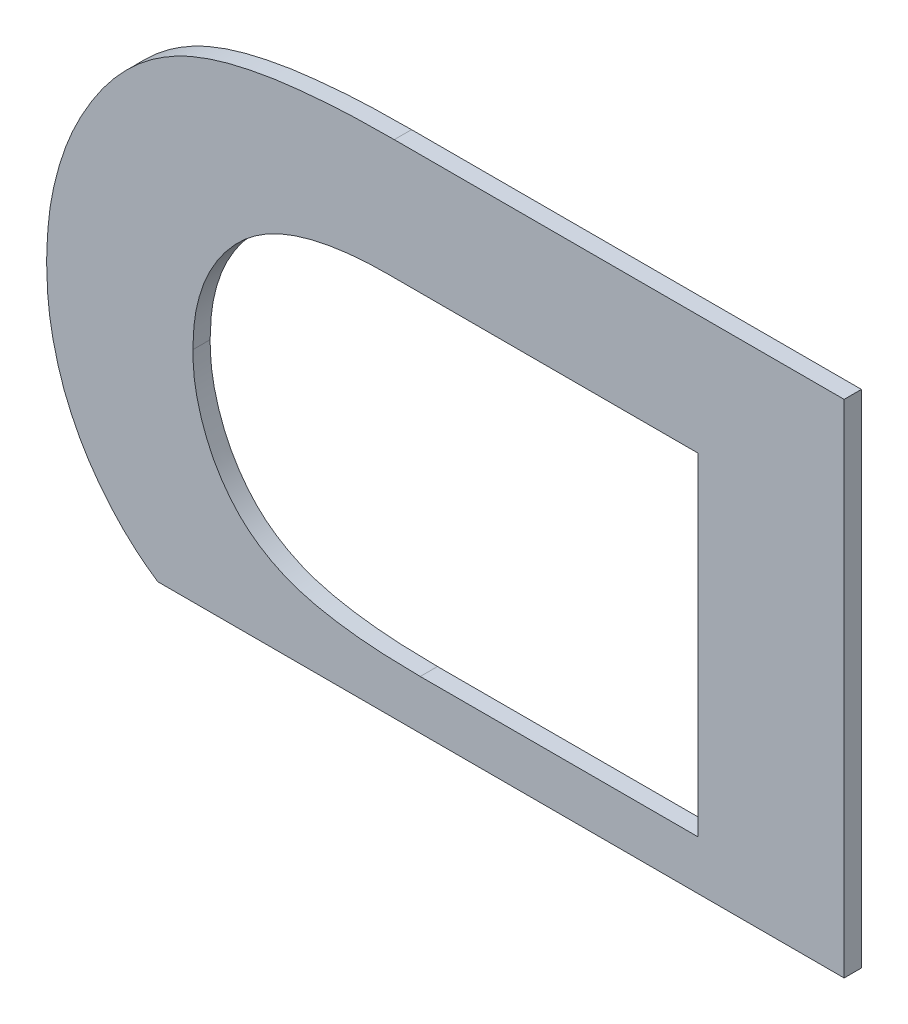
ISO-10303-21;
HEADER;
FILE_DESCRIPTION(('STEP AP214'),'2;1');
FILE_NAME('part.step','',(''),(''),'','','');
FILE_SCHEMA(('AUTOMOTIVE_DESIGN { 1 0 10303 214 1 1 1 1 }'));
ENDSEC;
DATA;
#1=APPLICATION_CONTEXT('core data for automotive mechanical design processes');
#2=APPLICATION_PROTOCOL_DEFINITION('international standard','automotive_design',2000,#1);
#3=PRODUCT_CONTEXT('',#1,'mechanical');
#4=PRODUCT('Part','Part','',(#3));
#5=PRODUCT_RELATED_PRODUCT_CATEGORY('part','',(#4));
#6=PRODUCT_DEFINITION_FORMATION('','',#4);
#7=PRODUCT_DEFINITION_CONTEXT('part definition',#1,'design');
#8=PRODUCT_DEFINITION('design','',#6,#7);
#9=PRODUCT_DEFINITION_SHAPE('','',#8);
#10=(LENGTH_UNIT() NAMED_UNIT(*) SI_UNIT(.MILLI.,.METRE.));
#11=(NAMED_UNIT(*) PLANE_ANGLE_UNIT() SI_UNIT($,.RADIAN.));
#12=(NAMED_UNIT(*) SI_UNIT($,.STERADIAN.) SOLID_ANGLE_UNIT());
#13=UNCERTAINTY_MEASURE_WITH_UNIT(LENGTH_MEASURE(1.E-05),#10,'distance_accuracy_value','');
#14=(GEOMETRIC_REPRESENTATION_CONTEXT(3) GLOBAL_UNCERTAINTY_ASSIGNED_CONTEXT((#13)) GLOBAL_UNIT_ASSIGNED_CONTEXT((#10,
#11,#12)) REPRESENTATION_CONTEXT('',''));
#15=CARTESIAN_POINT('',(0.,0.,0.));
#16=DIRECTION('',(0.,0.,1.));
#17=DIRECTION('',(1.,0.,0.));
#18=AXIS2_PLACEMENT_3D('',#15,#16,#17);
#19=CARTESIAN_POINT('',(11.5384615384616,-15.,0.5));
#20=DIRECTION('',(-1.,0.,0.));
#21=DIRECTION('',(0.,0.,1.));
#22=AXIS2_PLACEMENT_3D('',#19,#20,#21);
#23=PLANE('',#22);
#24=DIRECTION('',(0.,1.,0.));
#25=VECTOR('',#24,1.);
#26=CARTESIAN_POINT('',(11.5384615384616,-15.,0.5));
#27=LINE('',#26,#25);
#28=CARTESIAN_POINT('',(11.5384615384616,0.5,0.5));
#29=VERTEX_POINT('',#28);
#30=CARTESIAN_POINT('',(11.5384615384616,15.,0.5));
#31=VERTEX_POINT('',#30);
#32=EDGE_CURVE('E132',#29,#31,#27,.T.);
#33=ORIENTED_EDGE('',*,*,#32,.F.);
#34=DIRECTION('',(0.,0.,-1.));
#35=VECTOR('',#34,1.);
#36=CARTESIAN_POINT('',(11.5384615384616,0.5,0.5));
#37=LINE('',#36,#35);
#38=CARTESIAN_POINT('',(11.5384615384616,0.5,0.));
#39=VERTEX_POINT('',#38);
#40=EDGE_CURVE('E53',#29,#39,#37,.T.);
#41=ORIENTED_EDGE('',*,*,#40,.T.);
#42=DIRECTION('',(0.,1.,0.));
#43=VECTOR('',#42,1.);
#44=CARTESIAN_POINT('',(11.5384615384616,-15.,0.));
#45=LINE('',#44,#43);
#46=CARTESIAN_POINT('',(11.5384615384616,15.,0.));
#47=VERTEX_POINT('',#46);
#48=EDGE_CURVE('E128',#39,#47,#45,.T.);
#49=ORIENTED_EDGE('',*,*,#48,.T.);
#50=DIRECTION('',(0.,0.,-1.));
#51=VECTOR('',#50,1.);
#52=CARTESIAN_POINT('',(11.5384615384616,15.,0.5));
#53=LINE('',#52,#51);
#54=EDGE_CURVE('E164',#31,#47,#53,.T.);
#55=ORIENTED_EDGE('',*,*,#54,.F.);
#56=EDGE_LOOP('',(#33,#41,#49,#55));
#57=FACE_BOUND('',#56,.T.);
#58=ADVANCED_FACE('F39',(#57),#23,.F.);
#59=CARTESIAN_POINT('',(-11.5384615384615,6.91105769230769,0.5));
#60=CARTESIAN_POINT('',(-11.5325910596808,6.65443287104843,0.5));
#61=CARTESIAN_POINT('',(-11.5209964615086,6.14758125048622,0.5));
#62=CARTESIAN_POINT('',(-11.4321806731945,5.40237369942187,0.5));
#63=CARTESIAN_POINT('',(-11.27147567516,4.69035785069766,0.5));
#64=CARTESIAN_POINT('',(-11.065403190656,4.00529799715841,0.5));
#65=CARTESIAN_POINT('',(-10.7833528257358,3.35690034192733,0.5));
#66=CARTESIAN_POINT('',(-10.4566097203037,2.73192116530323,0.5));
#67=CARTESIAN_POINT('',(-10.0518214672469,2.14753031268846,0.5));
#68=CARTESIAN_POINT('',(-9.59861625564332,1.58816639265529,0.5));
#69=CARTESIAN_POINT('',(-9.07891141140609,1.06580948697466,0.5));
#70=CARTESIAN_POINT('',(-8.48813510211721,0.599304948528562,0.5));
#71=CARTESIAN_POINT('',(-7.83214355776586,0.179683182375531,0.5));
#72=CARTESIAN_POINT('',(-7.10784732151527,-0.181478283915422,0.5));
#73=CARTESIAN_POINT('',(-6.32358377122331,-0.511597010464015,0.5));
#74=CARTESIAN_POINT('',(-5.46951255367587,-0.777424515079016,0.5));
#75=CARTESIAN_POINT('',(-4.54908062908904,-0.994493056469318,0.5));
#76=CARTESIAN_POINT('',(-3.91099443386552,-1.0996060210974,0.5));
#77=CARTESIAN_POINT('',(-3.58173076923075,-1.15384615384615,0.5));
#78=B_SPLINE_CURVE_WITH_KNOTS('',3,(#59,#60,#61,#62,#63,#64,#65,#66,#67,#68,#69,#70,#71,#72,#73,
#74,#75,#76,#77),.UNSPECIFIED.,.F.,.F.,(4,1,1,1,1,1,1,1,1,1,1,1,1,1,1,1,4),(0.,
0.0614130692946595,0.121295023384547,0.17922404230872,0.235938094734832,0.292216833267361,
0.348196639434207,0.404444738963359,0.462025533922997,0.520334211868149,0.580382901650838,
0.641825904813988,0.706363209796628,0.77385139382756,0.845266257356883,0.920154675768406,1.),.UNSPECIFIED.);
#79=DIRECTION('',(0.,0.,-1.));
#80=VECTOR('',#79,1.);
#81=SURFACE_OF_LINEAR_EXTRUSION('',#78,#80);
#82=CARTESIAN_POINT('',(-11.5384615384615,6.91105769230769,0.));
#83=CARTESIAN_POINT('',(-11.5325910596808,6.65443287104843,0.));
#84=CARTESIAN_POINT('',(-11.5209964615086,6.14758125048622,0.));
#85=CARTESIAN_POINT('',(-11.4321806731945,5.40237369942187,0.));
#86=CARTESIAN_POINT('',(-11.27147567516,4.69035785069766,0.));
#87=CARTESIAN_POINT('',(-11.065403190656,4.00529799715841,0.));
#88=CARTESIAN_POINT('',(-10.7833528257358,3.35690034192733,0.));
#89=CARTESIAN_POINT('',(-10.4566097203037,2.73192116530323,0.));
#90=CARTESIAN_POINT('',(-10.0518214672469,2.14753031268846,0.));
#91=CARTESIAN_POINT('',(-9.59861625564332,1.58816639265529,0.));
#92=CARTESIAN_POINT('',(-9.07891141140609,1.06580948697466,0.));
#93=CARTESIAN_POINT('',(-8.48813510211721,0.599304948528562,0.));
#94=CARTESIAN_POINT('',(-7.83214355776586,0.179683182375531,0.));
#95=CARTESIAN_POINT('',(-7.10784732151527,-0.181478283915422,0.));
#96=CARTESIAN_POINT('',(-6.32358377122331,-0.511597010464015,0.));
#97=CARTESIAN_POINT('',(-5.46951255367587,-0.777424515079016,0.));
#98=CARTESIAN_POINT('',(-4.54908062908904,-0.994493056469318,0.));
#99=CARTESIAN_POINT('',(-3.91099443386552,-1.0996060210974,0.));
#100=CARTESIAN_POINT('',(-3.58173076923075,-1.15384615384615,0.));
#101=B_SPLINE_CURVE_WITH_KNOTS('',3,(#82,#83,#84,#85,#86,#87,#88,#89,#90,#91,#92,#93,#94,#95,
#96,#97,#98,#99,#100),.UNSPECIFIED.,.F.,.F.,(4,1,1,1,1,1,1,1,1,1,1,1,1,1,1,1,4),(0.,
0.0614130692946595,0.121295023384547,0.17922404230872,0.235938094734832,0.292216833267361,
0.348196639434207,0.404444738963359,0.462025533922997,0.520334211868149,0.580382901650838,
0.641825904813988,0.706363209796628,0.77385139382756,0.845266257356883,0.920154675768406,1.),.UNSPECIFIED.);
#102=CARTESIAN_POINT('',(-11.5384615384615,6.91105769230769,0.));
#103=VERTEX_POINT('',#102);
#104=CARTESIAN_POINT('',(-8.32266291929529,0.50000000308461,0.));
#105=VERTEX_POINT('',#104);
#106=EDGE_CURVE('E120',#103,#105,#101,.T.);
#107=ORIENTED_EDGE('',*,*,#106,.T.);
#108=DIRECTION('',(0.,0.,-1.));
#109=VECTOR('',#108,1.);
#110=CARTESIAN_POINT('',(-8.32266291471817,0.499999999997698,0.5));
#111=LINE('',#110,#109);
#112=CARTESIAN_POINT('',(-8.32266292016869,0.5,0.5));
#113=VERTEX_POINT('',#112);
#114=EDGE_CURVE('E106',#105,#113,#111,.F.);
#115=ORIENTED_EDGE('',*,*,#114,.T.);
#116=CARTESIAN_POINT('',(-11.5384615384615,6.91105769230769,0.5));
#117=VERTEX_POINT('',#116);
#118=EDGE_CURVE('E139',#117,#113,#78,.T.);
#119=ORIENTED_EDGE('',*,*,#118,.F.);
#120=DIRECTION('',(0.,0.,-1.));
#121=VECTOR('',#120,1.);
#122=CARTESIAN_POINT('',(-11.5384615384615,6.91105769230769,0.5));
#123=LINE('',#122,#121);
#124=EDGE_CURVE('E119',#117,#103,#123,.T.);
#125=ORIENTED_EDGE('',*,*,#124,.T.);
#126=EDGE_LOOP('',(#107,#115,#119,#125));
#127=FACE_BOUND('',#126,.T.);
#128=ADVANCED_FACE('F126',(#127),#81,.F.);
#129=CARTESIAN_POINT('',(-8.58731063474944,13.4318140781607,0.5));
#130=DIRECTION('',(0.,0.,-1.));
#131=DIRECTION('',(-1.,0.,0.));
#132=AXIS2_PLACEMENT_3D('',#129,#130,#131);
#133=PLANE('',#132);
#134=DIRECTION('',(1.,0.,0.));
#135=VECTOR('',#134,1.);
#136=CARTESIAN_POINT('',(-1.63461538461537,11.5384615384615,0.5));
#137=LINE('',#136,#135);
#138=CARTESIAN_POINT('',(-1.63461538461537,11.5384615384615,0.5));
#139=VERTEX_POINT('',#138);
#140=CARTESIAN_POINT('',(7.30769230769232,11.5384615384615,0.5));
#141=VERTEX_POINT('',#140);
#142=EDGE_CURVE('E174',#139,#141,#137,.T.);
#143=ORIENTED_EDGE('',*,*,#142,.T.);
#144=DIRECTION('',(0.,-1.,0.));
#145=VECTOR('',#144,1.);
#146=CARTESIAN_POINT('',(7.30769230769232,11.5384615384615,0.5));
#147=LINE('',#146,#145);
#148=CARTESIAN_POINT('',(7.30769230769232,1.92307692307692,0.5));
#149=VERTEX_POINT('',#148);
#150=EDGE_CURVE('E180',#141,#149,#147,.T.);
#151=ORIENTED_EDGE('',*,*,#150,.T.);
#152=DIRECTION('',(-1.,0.,0.));
#153=VECTOR('',#152,1.);
#154=CARTESIAN_POINT('',(7.30769230769232,1.92307692307692,0.5));
#155=LINE('',#154,#153);
#156=CARTESIAN_POINT('',(-0.727163461538446,1.92307692307692,0.5));
#157=VERTEX_POINT('',#156);
#158=EDGE_CURVE('E224',#149,#157,#155,.T.);
#159=ORIENTED_EDGE('',*,*,#158,.T.);
#160=CARTESIAN_POINT('',(-0.727163461538446,1.92307692307692,0.5));
#161=CARTESIAN_POINT('',(-1.13006156483063,1.92938064600475,0.5));
#162=CARTESIAN_POINT('',(-1.88324177958944,1.94116486476817,0.5));
#163=CARTESIAN_POINT('',(-2.9364451573548,2.04178970686716,0.5));
#164=CARTESIAN_POINT('',(-3.83400877311507,2.20168685411805,0.5));
#165=CARTESIAN_POINT('',(-4.59367617821513,2.43491556993435,0.5));
#166=CARTESIAN_POINT('',(-5.2319167092485,2.75871447726247,0.5));
#167=CARTESIAN_POINT('',(-5.78700662567105,3.15332395251479,0.5));
#168=CARTESIAN_POINT('',(-6.24829333358448,3.64761339971893,0.5));
#169=CARTESIAN_POINT('',(-6.63203622398317,4.20531380391618,0.5));
#170=CARTESIAN_POINT('',(-6.93032744494692,4.81903526019314,0.5));
#171=CARTESIAN_POINT('',(-7.14550050462285,5.46365966982212,0.5));
#172=CARTESIAN_POINT('',(-7.28633501461862,6.13376938170689,0.5));
#173=CARTESIAN_POINT('',(-7.30051015672434,6.58983677494433,0.5));
#174=CARTESIAN_POINT('',(-7.30769230769229,6.82091346153846,0.5));
#175=B_SPLINE_CURVE_WITH_KNOTS('',3,(#160,#161,#162,#163,#164,#165,#166,#167,#168,#169,#170,
#171,#172,#173,#174),.UNSPECIFIED.,.F.,.F.,(4,1,1,1,1,1,1,1,1,1,1,1,4),(0.,0.128860268041731,
0.240892184809229,0.338044201557511,0.420120485213609,0.494058456868551,0.56609478358332,
0.63680495435101,0.70914844936072,0.781941805594127,0.854285300603837,0.926170407216559,1.),.UNSPECIFIED.);
#176=CARTESIAN_POINT('',(-7.30769230769229,6.82091346153846,0.5));
#177=VERTEX_POINT('',#176);
#178=EDGE_CURVE('E219',#157,#177,#175,.T.);
#179=ORIENTED_EDGE('',*,*,#178,.T.);
#180=CARTESIAN_POINT('',(-7.30769230769229,6.82091346153846,0.5));
#181=CARTESIAN_POINT('',(-7.30210848529049,6.9893078298258,0.5));
#182=CARTESIAN_POINT('',(-7.29117141753103,7.31914292910746,0.5));
#183=CARTESIAN_POINT('',(-7.2338356910939,7.80324927986051,0.5));
#184=CARTESIAN_POINT('',(-7.12236142624104,8.26326221009573,0.5));
#185=CARTESIAN_POINT('',(-6.97515993304978,8.70161339986799,0.5));
#186=CARTESIAN_POINT('',(-6.77846886738574,9.11509224009393,0.5));
#187=CARTESIAN_POINT('',(-6.54480790558805,9.50690273468159,0.5));
#188=CARTESIAN_POINT('',(-6.26597824425768,9.87487331168712,0.5));
#189=CARTESIAN_POINT('',(-5.94659491088337,10.2201248658801,0.5));
#190=CARTESIAN_POINT('',(-5.57988480322014,10.5342700397789,0.5));
#191=CARTESIAN_POINT('',(-5.16101564868316,10.8053091884708,0.5));
#192=CARTESIAN_POINT('',(-4.69329104368789,11.03563399291,0.5));
#193=CARTESIAN_POINT('',(-4.17616733448818,11.218435154666,0.5));
#194=CARTESIAN_POINT('',(-3.61127355525259,11.364646327694,0.5));
#195=CARTESIAN_POINT('',(-2.99539389014869,11.4619159052292,0.5));
#196=CARTESIAN_POINT('',(-2.33134488840621,11.53229984733,0.5));
#197=CARTESIAN_POINT('',(-1.87119743947005,11.5363692694513,0.5));
#198=CARTESIAN_POINT('',(-1.63461538461537,11.5384615384615,0.5));
#199=B_SPLINE_CURVE_WITH_KNOTS('',3,(#180,#181,#182,#183,#184,#185,#186,#187,#188,#189,#190,
#191,#192,#193,#194,#195,#196,#197,#198),.UNSPECIFIED.,.F.,.F.,(4,1,1,1,1,1,1,1,1,1,1,1,1,1,1,1,
4),(0.,0.0603255293380431,0.118159990507998,0.174186676296381,0.229538818145799,
0.283449814638637,0.337826511950593,0.392632102533484,0.448465576415191,0.505965409157305,
0.565058532229005,0.626654478622844,0.692232033037364,0.761131078125762,0.835309877339421,
0.915325559832202,1.),.UNSPECIFIED.);
#200=EDGE_CURVE('E144',#177,#139,#199,.T.);
#201=ORIENTED_EDGE('',*,*,#200,.T.);
#202=EDGE_LOOP('',(#143,#151,#159,#179,#201));
#203=FACE_BOUND('',#202,.T.);
#204=ORIENTED_EDGE('',*,*,#118,.T.);
#205=DIRECTION('',(1.,0.,0.));
#206=VECTOR('',#205,1.);
#207=CARTESIAN_POINT('',(-8.58731063474944,0.5,0.5));
#208=LINE('',#207,#206);
#209=EDGE_CURVE('E115',#113,#29,#208,.T.);
#210=ORIENTED_EDGE('',*,*,#209,.T.);
#211=ORIENTED_EDGE('',*,*,#32,.T.);
#212=DIRECTION('',(-1.,0.,0.));
#213=VECTOR('',#212,1.);
#214=CARTESIAN_POINT('',(11.5384615384616,15.,0.5));
#215=LINE('',#214,#213);
#216=CARTESIAN_POINT('',(-1.47836538461537,15.,0.5));
#217=VERTEX_POINT('',#216);
#218=EDGE_CURVE('E137',#31,#217,#215,.T.);
#219=ORIENTED_EDGE('',*,*,#218,.T.);
#220=CARTESIAN_POINT('',(-1.47836538461537,15.,0.5));
#221=CARTESIAN_POINT('',(-1.78487180129392,14.9975983953887,0.5));
#222=CARTESIAN_POINT('',(-2.37807909563972,14.9929503707601,0.5));
#223=CARTESIAN_POINT('',(-3.23835215647599,14.9600476351091,0.5));
#224=CARTESIAN_POINT('',(-4.04133081698087,14.889117968386,0.5));
#225=CARTESIAN_POINT('',(-4.78849148624779,14.812417419328,0.5));
#226=CARTESIAN_POINT('',(-5.47970141524678,14.6946923207327,0.5));
#227=CARTESIAN_POINT('',(-6.1142475015171,14.5596642921198,0.5));
#228=CARTESIAN_POINT('',(-6.69310945212932,14.3989788966131,0.5));
#229=CARTESIAN_POINT('',(-7.21887513013616,14.2091970572724,0.5));
#230=CARTESIAN_POINT('',(-7.70667103557433,13.9944873372387,0.5));
#231=CARTESIAN_POINT('',(-8.15882099415439,13.7295702077918,0.5));
#232=CARTESIAN_POINT('',(-8.59412029689722,13.4392775204505,0.5));
#233=CARTESIAN_POINT('',(-8.9964134680683,13.0982269349557,0.5));
#234=CARTESIAN_POINT('',(-9.37631102941296,12.7248081112423,0.5));
#235=CARTESIAN_POINT('',(-9.73346087993234,12.3139470797305,0.5));
#236=CARTESIAN_POINT('',(-10.0625757002895,11.8620784028443,0.5));
#237=CARTESIAN_POINT('',(-10.4684994172491,11.2153606167208,0.5));
#238=CARTESIAN_POINT('',(-10.9039728045629,10.3540687144086,0.5));
#239=CARTESIAN_POINT('',(-11.2667905371209,9.25180170196583,0.5));
#240=CARTESIAN_POINT('',(-11.5007289206225,8.09879017368183,0.5));
#241=CARTESIAN_POINT('',(-11.5257609960466,7.3108403636725,0.5));
#242=CARTESIAN_POINT('',(-11.5384615384615,6.91105769230769,0.5));
#243=B_SPLINE_CURVE_WITH_KNOTS('',3,(#220,#221,#222,#223,#224,#225,#226,#227,#228,#229,#230,
#231,#232,#233,#234,#235,#236,#237,#238,#239,#240,#241,#242),.UNSPECIFIED.,.F.,.F.,(4,1,1,1,1,1,
1,1,1,1,1,1,1,1,1,1,1,1,1,1,4),(0.,0.0621127506505295,0.120211958878554,0.174385121388474,
0.225443755778487,0.272358212636177,0.316388162963441,0.356869479058228,0.393978323506367,
0.429589371877092,0.464683040954987,0.50003634614284,0.535482747753064,0.571363467148443,
0.60790853220526,0.645662298533116,0.684517339703578,0.762578622376346,0.84049728865418,
0.919072992693523,1.),.UNSPECIFIED.);
#244=EDGE_CURVE('E167',#217,#117,#243,.T.);
#245=ORIENTED_EDGE('',*,*,#244,.T.);
#246=EDGE_LOOP('',(#204,#210,#211,#219,#245));
#247=FACE_BOUND('',#246,.T.);
#248=ADVANCED_FACE('F154',(#203,#247),#133,.F.);
#249=CARTESIAN_POINT('',(11.5384615384616,15.,0.5));
#250=DIRECTION('',(0.,-1.,0.));
#251=DIRECTION('',(0.,0.,-1.));
#252=AXIS2_PLACEMENT_3D('',#249,#250,#251);
#253=PLANE('',#252);
#254=DIRECTION('',(-1.,0.,0.));
#255=VECTOR('',#254,1.);
#256=CARTESIAN_POINT('',(11.5384615384616,15.,0.));
#257=LINE('',#256,#255);
#258=CARTESIAN_POINT('',(-1.47836538461537,15.,0.));
#259=VERTEX_POINT('',#258);
#260=EDGE_CURVE('E169',#47,#259,#257,.T.);
#261=ORIENTED_EDGE('',*,*,#260,.T.);
#262=DIRECTION('',(0.,0.,-1.));
#263=VECTOR('',#262,1.);
#264=CARTESIAN_POINT('',(-1.47836538461537,15.,0.5));
#265=LINE('',#264,#263);
#266=EDGE_CURVE('E181',#217,#259,#265,.T.);
#267=ORIENTED_EDGE('',*,*,#266,.F.);
#268=ORIENTED_EDGE('',*,*,#218,.F.);
#269=ORIENTED_EDGE('',*,*,#54,.T.);
#270=EDGE_LOOP('',(#261,#267,#268,#269));
#271=FACE_BOUND('',#270,.T.);
#272=ADVANCED_FACE('F202',(#271),#253,.F.);
#273=DIRECTION('',(0.,0.,-1.));
#274=VECTOR('',#273,1.);
#275=SURFACE_OF_LINEAR_EXTRUSION('',#243,#274);
#276=CARTESIAN_POINT('',(-1.47836538461537,15.,0.));
#277=CARTESIAN_POINT('',(-1.78487180129392,14.9975983953887,0.));
#278=CARTESIAN_POINT('',(-2.37807909563972,14.9929503707601,0.));
#279=CARTESIAN_POINT('',(-3.23835215647599,14.9600476351091,0.));
#280=CARTESIAN_POINT('',(-4.04133081698087,14.889117968386,0.));
#281=CARTESIAN_POINT('',(-4.78849148624779,14.812417419328,0.));
#282=CARTESIAN_POINT('',(-5.47970141524678,14.6946923207327,0.));
#283=CARTESIAN_POINT('',(-6.1142475015171,14.5596642921198,0.));
#284=CARTESIAN_POINT('',(-6.69310945212932,14.3989788966131,0.));
#285=CARTESIAN_POINT('',(-7.21887513013616,14.2091970572724,0.));
#286=CARTESIAN_POINT('',(-7.70667103557433,13.9944873372387,0.));
#287=CARTESIAN_POINT('',(-8.15882099415439,13.7295702077918,0.));
#288=CARTESIAN_POINT('',(-8.59412029689722,13.4392775204505,0.));
#289=CARTESIAN_POINT('',(-8.9964134680683,13.0982269349557,0.));
#290=CARTESIAN_POINT('',(-9.37631102941296,12.7248081112423,0.));
#291=CARTESIAN_POINT('',(-9.73346087993234,12.3139470797305,0.));
#292=CARTESIAN_POINT('',(-10.0625757002895,11.8620784028443,0.));
#293=CARTESIAN_POINT('',(-10.4684994172491,11.2153606167208,0.));
#294=CARTESIAN_POINT('',(-10.9039728045629,10.3540687144086,0.));
#295=CARTESIAN_POINT('',(-11.2667905371209,9.25180170196583,0.));
#296=CARTESIAN_POINT('',(-11.5007289206225,8.09879017368183,0.));
#297=CARTESIAN_POINT('',(-11.5257609960466,7.3108403636725,0.));
#298=CARTESIAN_POINT('',(-11.5384615384615,6.91105769230769,0.));
#299=B_SPLINE_CURVE_WITH_KNOTS('',3,(#276,#277,#278,#279,#280,#281,#282,#283,#284,#285,#286,
#287,#288,#289,#290,#291,#292,#293,#294,#295,#296,#297,#298),.UNSPECIFIED.,.F.,.F.,(4,1,1,1,1,1,
1,1,1,1,1,1,1,1,1,1,1,1,1,1,4),(0.,0.0621127506505295,0.120211958878554,0.174385121388474,
0.225443755778487,0.272358212636177,0.316388162963441,0.356869479058228,0.393978323506367,
0.429589371877092,0.464683040954987,0.50003634614284,0.535482747753064,0.571363467148443,
0.60790853220526,0.645662298533116,0.684517339703578,0.762578622376346,0.84049728865418,
0.919072992693523,1.),.UNSPECIFIED.);
#300=EDGE_CURVE('E171',#259,#103,#299,.T.);
#301=ORIENTED_EDGE('',*,*,#300,.T.);
#302=ORIENTED_EDGE('',*,*,#124,.F.);
#303=ORIENTED_EDGE('',*,*,#244,.F.);
#304=ORIENTED_EDGE('',*,*,#266,.T.);
#305=EDGE_LOOP('',(#301,#302,#303,#304));
#306=FACE_BOUND('',#305,.T.);
#307=ADVANCED_FACE('F175',(#306),#275,.F.);
#308=CARTESIAN_POINT('',(-8.58731063474944,13.4318140781607,0.));
#309=DIRECTION('',(0.,0.,-1.));
#310=DIRECTION('',(-1.,0.,0.));
#311=AXIS2_PLACEMENT_3D('',#308,#309,#310);
#312=PLANE('',#311);
#313=DIRECTION('',(1.,0.,0.));
#314=VECTOR('',#313,1.);
#315=CARTESIAN_POINT('',(-8.58731063474944,0.5,0.));
#316=LINE('',#315,#314);
#317=EDGE_CURVE('E11',#105,#39,#316,.T.);
#318=ORIENTED_EDGE('',*,*,#317,.F.);
#319=ORIENTED_EDGE('',*,*,#106,.F.);
#320=ORIENTED_EDGE('',*,*,#300,.F.);
#321=ORIENTED_EDGE('',*,*,#260,.F.);
#322=ORIENTED_EDGE('',*,*,#48,.F.);
#323=EDGE_LOOP('',(#318,#319,#320,#321,#322));
#324=FACE_BOUND('',#323,.T.);
#325=DIRECTION('',(0.,-1.,0.));
#326=VECTOR('',#325,1.);
#327=CARTESIAN_POINT('',(7.30769230769232,11.5384615384615,0.));
#328=LINE('',#327,#326);
#329=CARTESIAN_POINT('',(7.30769230769232,11.5384615384615,0.));
#330=VERTEX_POINT('',#329);
#331=CARTESIAN_POINT('',(7.30769230769232,1.92307692307692,0.));
#332=VERTEX_POINT('',#331);
#333=EDGE_CURVE('E243',#330,#332,#328,.T.);
#334=ORIENTED_EDGE('',*,*,#333,.F.);
#335=DIRECTION('',(1.,0.,0.));
#336=VECTOR('',#335,1.);
#337=CARTESIAN_POINT('',(-1.63461538461537,11.5384615384615,0.));
#338=LINE('',#337,#336);
#339=CARTESIAN_POINT('',(-1.63461538461537,11.5384615384615,0.));
#340=VERTEX_POINT('',#339);
#341=EDGE_CURVE('E261',#340,#330,#338,.T.);
#342=ORIENTED_EDGE('',*,*,#341,.F.);
#343=CARTESIAN_POINT('',(-7.30769230769229,6.82091346153846,0.));
#344=CARTESIAN_POINT('',(-7.30210848529049,6.9893078298258,0.));
#345=CARTESIAN_POINT('',(-7.29117141753103,7.31914292910746,0.));
#346=CARTESIAN_POINT('',(-7.2338356910939,7.80324927986051,0.));
#347=CARTESIAN_POINT('',(-7.12236142624104,8.26326221009573,0.));
#348=CARTESIAN_POINT('',(-6.97515993304978,8.70161339986799,0.));
#349=CARTESIAN_POINT('',(-6.77846886738574,9.11509224009393,0.));
#350=CARTESIAN_POINT('',(-6.54480790558805,9.50690273468159,0.));
#351=CARTESIAN_POINT('',(-6.26597824425768,9.87487331168712,0.));
#352=CARTESIAN_POINT('',(-5.94659491088337,10.2201248658801,0.));
#353=CARTESIAN_POINT('',(-5.57988480322014,10.5342700397789,0.));
#354=CARTESIAN_POINT('',(-5.16101564868316,10.8053091884708,0.));
#355=CARTESIAN_POINT('',(-4.69329104368789,11.03563399291,0.));
#356=CARTESIAN_POINT('',(-4.17616733448818,11.218435154666,0.));
#357=CARTESIAN_POINT('',(-3.61127355525259,11.364646327694,0.));
#358=CARTESIAN_POINT('',(-2.99539389014869,11.4619159052292,0.));
#359=CARTESIAN_POINT('',(-2.33134488840621,11.53229984733,0.));
#360=CARTESIAN_POINT('',(-1.87119743947005,11.5363692694513,0.));
#361=CARTESIAN_POINT('',(-1.63461538461537,11.5384615384615,0.));
#362=B_SPLINE_CURVE_WITH_KNOTS('',3,(#343,#344,#345,#346,#347,#348,#349,#350,#351,#352,#353,
#354,#355,#356,#357,#358,#359,#360,#361),.UNSPECIFIED.,.F.,.F.,(4,1,1,1,1,1,1,1,1,1,1,1,1,1,1,1,
4),(0.,0.0603255293380431,0.118159990507998,0.174186676296381,0.229538818145799,
0.283449814638637,0.337826511950593,0.392632102533484,0.448465576415191,0.505965409157305,
0.565058532229005,0.626654478622844,0.692232033037364,0.761131078125762,0.835309877339421,
0.915325559832202,1.),.UNSPECIFIED.);
#363=CARTESIAN_POINT('',(-7.30769230769229,6.82091346153846,0.));
#364=VERTEX_POINT('',#363);
#365=EDGE_CURVE('E259',#364,#340,#362,.T.);
#366=ORIENTED_EDGE('',*,*,#365,.F.);
#367=CARTESIAN_POINT('',(-0.727163461538446,1.92307692307692,0.));
#368=CARTESIAN_POINT('',(-1.13006156483063,1.92938064600475,0.));
#369=CARTESIAN_POINT('',(-1.88324177958944,1.94116486476817,0.));
#370=CARTESIAN_POINT('',(-2.9364451573548,2.04178970686716,0.));
#371=CARTESIAN_POINT('',(-3.83400877311507,2.20168685411805,0.));
#372=CARTESIAN_POINT('',(-4.59367617821513,2.43491556993435,0.));
#373=CARTESIAN_POINT('',(-5.2319167092485,2.75871447726247,0.));
#374=CARTESIAN_POINT('',(-5.78700662567105,3.15332395251479,0.));
#375=CARTESIAN_POINT('',(-6.24829333358448,3.64761339971893,0.));
#376=CARTESIAN_POINT('',(-6.63203622398317,4.20531380391618,0.));
#377=CARTESIAN_POINT('',(-6.93032744494692,4.81903526019314,0.));
#378=CARTESIAN_POINT('',(-7.14550050462285,5.46365966982212,0.));
#379=CARTESIAN_POINT('',(-7.28633501461862,6.13376938170689,0.));
#380=CARTESIAN_POINT('',(-7.30051015672434,6.58983677494433,0.));
#381=CARTESIAN_POINT('',(-7.30769230769229,6.82091346153846,0.));
#382=B_SPLINE_CURVE_WITH_KNOTS('',3,(#367,#368,#369,#370,#371,#372,#373,#374,#375,#376,#377,
#378,#379,#380,#381),.UNSPECIFIED.,.F.,.F.,(4,1,1,1,1,1,1,1,1,1,1,1,4),(0.,0.128860268041731,
0.240892184809229,0.338044201557511,0.420120485213609,0.494058456868551,0.56609478358332,
0.63680495435101,0.70914844936072,0.781941805594127,0.854285300603837,0.926170407216559,1.),.UNSPECIFIED.);
#383=CARTESIAN_POINT('',(-0.727163461538446,1.92307692307692,0.));
#384=VERTEX_POINT('',#383);
#385=EDGE_CURVE('E255',#384,#364,#382,.T.);
#386=ORIENTED_EDGE('',*,*,#385,.F.);
#387=DIRECTION('',(-1.,0.,0.));
#388=VECTOR('',#387,1.);
#389=CARTESIAN_POINT('',(7.30769230769232,1.92307692307692,0.));
#390=LINE('',#389,#388);
#391=EDGE_CURVE('E246',#332,#384,#390,.T.);
#392=ORIENTED_EDGE('',*,*,#391,.F.);
#393=EDGE_LOOP('',(#334,#342,#366,#386,#392));
#394=FACE_BOUND('',#393,.T.);
#395=ADVANCED_FACE('F41',(#324,#394),#312,.T.);
#396=CARTESIAN_POINT('',(7.30769230769232,11.5384615384615,0.5));
#397=DIRECTION('',(1.,0.,0.));
#398=DIRECTION('',(0.,0.,-1.));
#399=AXIS2_PLACEMENT_3D('',#396,#397,#398);
#400=PLANE('',#399);
#401=ORIENTED_EDGE('',*,*,#333,.T.);
#402=DIRECTION('',(0.,0.,-1.));
#403=VECTOR('',#402,1.);
#404=CARTESIAN_POINT('',(7.30769230769232,1.92307692307692,0.5));
#405=LINE('',#404,#403);
#406=EDGE_CURVE('E48',#149,#332,#405,.T.);
#407=ORIENTED_EDGE('',*,*,#406,.F.);
#408=ORIENTED_EDGE('',*,*,#150,.F.);
#409=DIRECTION('',(0.,0.,-1.));
#410=VECTOR('',#409,1.);
#411=CARTESIAN_POINT('',(7.30769230769232,11.5384615384615,0.5));
#412=LINE('',#411,#410);
#413=EDGE_CURVE('E242',#141,#330,#412,.T.);
#414=ORIENTED_EDGE('',*,*,#413,.T.);
#415=EDGE_LOOP('',(#401,#407,#408,#414));
#416=FACE_BOUND('',#415,.T.);
#417=ADVANCED_FACE('F205',(#416),#400,.F.);
#418=CARTESIAN_POINT('',(-1.63461538461537,11.5384615384615,0.5));
#419=DIRECTION('',(0.,1.,0.));
#420=DIRECTION('',(0.,0.,1.));
#421=AXIS2_PLACEMENT_3D('',#418,#419,#420);
#422=PLANE('',#421);
#423=ORIENTED_EDGE('',*,*,#341,.T.);
#424=ORIENTED_EDGE('',*,*,#413,.F.);
#425=ORIENTED_EDGE('',*,*,#142,.F.);
#426=DIRECTION('',(0.,0.,-1.));
#427=VECTOR('',#426,1.);
#428=CARTESIAN_POINT('',(-1.63461538461537,11.5384615384615,0.5));
#429=LINE('',#428,#427);
#430=EDGE_CURVE('E263',#139,#340,#429,.T.);
#431=ORIENTED_EDGE('',*,*,#430,.T.);
#432=EDGE_LOOP('',(#423,#424,#425,#431));
#433=FACE_BOUND('',#432,.T.);
#434=ADVANCED_FACE('F203',(#433),#422,.F.);
#435=DIRECTION('',(0.,0.,-1.));
#436=VECTOR('',#435,1.);
#437=SURFACE_OF_LINEAR_EXTRUSION('',#199,#436);
#438=ORIENTED_EDGE('',*,*,#365,.T.);
#439=ORIENTED_EDGE('',*,*,#430,.F.);
#440=ORIENTED_EDGE('',*,*,#200,.F.);
#441=DIRECTION('',(0.,0.,-1.));
#442=VECTOR('',#441,1.);
#443=CARTESIAN_POINT('',(-7.30769230769229,6.82091346153846,0.5));
#444=LINE('',#443,#442);
#445=EDGE_CURVE('E258',#177,#364,#444,.T.);
#446=ORIENTED_EDGE('',*,*,#445,.T.);
#447=EDGE_LOOP('',(#438,#439,#440,#446));
#448=FACE_BOUND('',#447,.T.);
#449=ADVANCED_FACE('F214',(#448),#437,.F.);
#450=DIRECTION('',(0.,0.,-1.));
#451=VECTOR('',#450,1.);
#452=SURFACE_OF_LINEAR_EXTRUSION('',#175,#451);
#453=ORIENTED_EDGE('',*,*,#385,.T.);
#454=ORIENTED_EDGE('',*,*,#445,.F.);
#455=ORIENTED_EDGE('',*,*,#178,.F.);
#456=DIRECTION('',(0.,0.,-1.));
#457=VECTOR('',#456,1.);
#458=CARTESIAN_POINT('',(-0.727163461538446,1.92307692307692,0.5));
#459=LINE('',#458,#457);
#460=EDGE_CURVE('E248',#157,#384,#459,.T.);
#461=ORIENTED_EDGE('',*,*,#460,.T.);
#462=EDGE_LOOP('',(#453,#454,#455,#461));
#463=FACE_BOUND('',#462,.T.);
#464=ADVANCED_FACE('F208',(#463),#452,.F.);
#465=CARTESIAN_POINT('',(7.30769230769232,1.92307692307692,0.5));
#466=DIRECTION('',(0.,-1.,0.));
#467=DIRECTION('',(0.,0.,-1.));
#468=AXIS2_PLACEMENT_3D('',#465,#466,#467);
#469=PLANE('',#468);
#470=ORIENTED_EDGE('',*,*,#391,.T.);
#471=ORIENTED_EDGE('',*,*,#460,.F.);
#472=ORIENTED_EDGE('',*,*,#158,.F.);
#473=ORIENTED_EDGE('',*,*,#406,.T.);
#474=EDGE_LOOP('',(#470,#471,#472,#473));
#475=FACE_BOUND('',#474,.T.);
#476=ADVANCED_FACE('F209',(#475),#469,.F.);
#477=CARTESIAN_POINT('',(-17.,0.5,1.000025));
#478=DIRECTION('',(0.,1.,0.));
#479=DIRECTION('',(0.,0.,1.));
#480=AXIS2_PLACEMENT_3D('',#477,#478,#479);
#481=PLANE('',#480);
#482=ORIENTED_EDGE('',*,*,#209,.F.);
#483=ORIENTED_EDGE('',*,*,#114,.F.);
#484=ORIENTED_EDGE('',*,*,#317,.T.);
#485=ORIENTED_EDGE('',*,*,#40,.F.);
#486=EDGE_LOOP('',(#482,#483,#484,#485));
#487=FACE_BOUND('',#486,.T.);
#488=ADVANCED_FACE('F112',(#487),#481,.F.);
#489=CLOSED_SHELL('',(#58,#128,#248,#272,#307,#395,#417,#434,#449,#464,#476,#488));
#490=MANIFOLD_SOLID_BREP('B2',#489);
#491=ADVANCED_BREP_SHAPE_REPRESENTATION('',(#18,#490),#14);
#492=SHAPE_DEFINITION_REPRESENTATION(#9,#491);
ENDSEC;
END-ISO-10303-21;
